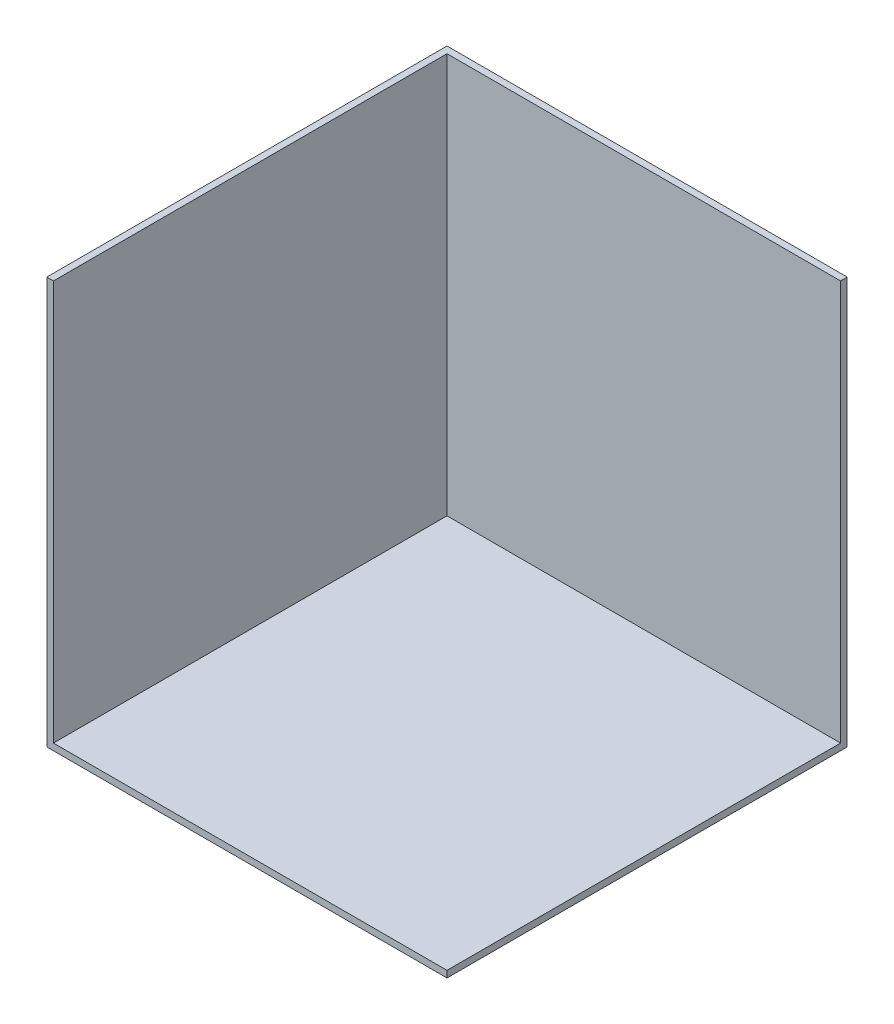
ISO-10303-21;
HEADER;
FILE_DESCRIPTION(('STEP AP214'),'2;1');
FILE_NAME('part.step','',(''),(''),'','','');
FILE_SCHEMA(('AUTOMOTIVE_DESIGN { 1 0 10303 214 1 1 1 1 }'));
ENDSEC;
DATA;
#1=APPLICATION_CONTEXT('core data for automotive mechanical design processes');
#2=APPLICATION_PROTOCOL_DEFINITION('international standard','automotive_design',2000,#1);
#3=PRODUCT_CONTEXT('',#1,'mechanical');
#4=PRODUCT('Part','Part','',(#3));
#5=PRODUCT_RELATED_PRODUCT_CATEGORY('part','',(#4));
#6=PRODUCT_DEFINITION_FORMATION('','',#4);
#7=PRODUCT_DEFINITION_CONTEXT('part definition',#1,'design');
#8=PRODUCT_DEFINITION('design','',#6,#7);
#9=PRODUCT_DEFINITION_SHAPE('','',#8);
#10=(LENGTH_UNIT() NAMED_UNIT(*) SI_UNIT(.MILLI.,.METRE.));
#11=(NAMED_UNIT(*) PLANE_ANGLE_UNIT() SI_UNIT($,.RADIAN.));
#12=(NAMED_UNIT(*) SI_UNIT($,.STERADIAN.) SOLID_ANGLE_UNIT());
#13=UNCERTAINTY_MEASURE_WITH_UNIT(LENGTH_MEASURE(1.E-05),#10,'distance_accuracy_value','');
#14=(GEOMETRIC_REPRESENTATION_CONTEXT(3) GLOBAL_UNCERTAINTY_ASSIGNED_CONTEXT((#13)) GLOBAL_UNIT_ASSIGNED_CONTEXT((#10,
#11,#12)) REPRESENTATION_CONTEXT('',''));
#15=CARTESIAN_POINT('',(0.,0.,0.));
#16=DIRECTION('',(0.,0.,1.));
#17=DIRECTION('',(1.,0.,0.));
#18=AXIS2_PLACEMENT_3D('',#15,#16,#17);
#19=CARTESIAN_POINT('',(3000.,100.,-3000.));
#20=DIRECTION('',(-1.,0.,0.));
#21=DIRECTION('',(0.,0.,1.));
#22=AXIS2_PLACEMENT_3D('',#19,#20,#21);
#23=PLANE('',#22);
#24=DIRECTION('',(0.,0.,-1.));
#25=VECTOR('',#24,1.);
#26=CARTESIAN_POINT('',(3000.,0.,-3000.));
#27=LINE('',#26,#25);
#28=CARTESIAN_POINT('',(3000.,0.,3000.));
#29=VERTEX_POINT('',#28);
#30=CARTESIAN_POINT('',(3000.,0.,-3000.));
#31=VERTEX_POINT('',#30);
#32=EDGE_CURVE('E140',#29,#31,#27,.T.);
#33=ORIENTED_EDGE('',*,*,#32,.T.);
#34=DIRECTION('',(0.,-1.,0.));
#35=VECTOR('',#34,1.);
#36=CARTESIAN_POINT('',(3000.,100.,-3000.));
#37=LINE('',#36,#35);
#38=CARTESIAN_POINT('',(3000.,6100.,-3000.));
#39=VERTEX_POINT('',#38);
#40=EDGE_CURVE('E11',#39,#31,#37,.T.);
#41=ORIENTED_EDGE('',*,*,#40,.F.);
#42=DIRECTION('',(0.,0.,-1.));
#43=VECTOR('',#42,1.);
#44=CARTESIAN_POINT('',(3000.,6100.,-2900.));
#45=LINE('',#44,#43);
#46=CARTESIAN_POINT('',(3000.,6100.,-2900.));
#47=VERTEX_POINT('',#46);
#48=EDGE_CURVE('E112',#47,#39,#45,.T.);
#49=ORIENTED_EDGE('',*,*,#48,.F.);
#50=DIRECTION('',(0.,-1.,0.));
#51=VECTOR('',#50,1.);
#52=CARTESIAN_POINT('',(3000.,6100.,-2900.));
#53=LINE('',#52,#51);
#54=CARTESIAN_POINT('',(3000.,100.,-2900.));
#55=VERTEX_POINT('',#54);
#56=EDGE_CURVE('E123',#47,#55,#53,.T.);
#57=ORIENTED_EDGE('',*,*,#56,.T.);
#58=DIRECTION('',(0.,0.,-1.));
#59=VECTOR('',#58,1.);
#60=CARTESIAN_POINT('',(3000.,100.,-3000.));
#61=LINE('',#60,#59);
#62=CARTESIAN_POINT('',(3000.,100.,3000.));
#63=VERTEX_POINT('',#62);
#64=EDGE_CURVE('E54',#63,#55,#61,.T.);
#65=ORIENTED_EDGE('',*,*,#64,.F.);
#66=DIRECTION('',(0.,-1.,0.));
#67=VECTOR('',#66,1.);
#68=CARTESIAN_POINT('',(3000.,100.,3000.));
#69=LINE('',#68,#67);
#70=EDGE_CURVE('E153',#63,#29,#69,.T.);
#71=ORIENTED_EDGE('',*,*,#70,.T.);
#72=EDGE_LOOP('',(#33,#41,#49,#57,#65,#71));
#73=FACE_BOUND('',#72,.T.);
#74=ADVANCED_FACE('F33',(#73),#23,.F.);
#75=CARTESIAN_POINT('',(-3000.,100.,-3000.));
#76=DIRECTION('',(0.,0.,1.));
#77=DIRECTION('',(1.,0.,0.));
#78=AXIS2_PLACEMENT_3D('',#75,#76,#77);
#79=PLANE('',#78);
#80=DIRECTION('',(-1.,0.,0.));
#81=VECTOR('',#80,1.);
#82=CARTESIAN_POINT('',(-3000.,0.,-3000.));
#83=LINE('',#82,#81);
#84=CARTESIAN_POINT('',(-3000.,0.,-3000.));
#85=VERTEX_POINT('',#84);
#86=EDGE_CURVE('E96',#31,#85,#83,.T.);
#87=ORIENTED_EDGE('',*,*,#86,.T.);
#88=DIRECTION('',(0.,-1.,0.));
#89=VECTOR('',#88,1.);
#90=CARTESIAN_POINT('',(-3000.,100.,-3000.));
#91=LINE('',#90,#89);
#92=CARTESIAN_POINT('',(-3000.,6100.,-3000.));
#93=VERTEX_POINT('',#92);
#94=EDGE_CURVE('E41',#93,#85,#91,.T.);
#95=ORIENTED_EDGE('',*,*,#94,.F.);
#96=DIRECTION('',(-1.,0.,0.));
#97=VECTOR('',#96,1.);
#98=CARTESIAN_POINT('',(3000.,6100.,-3000.));
#99=LINE('',#98,#97);
#100=EDGE_CURVE('E95',#39,#93,#99,.T.);
#101=ORIENTED_EDGE('',*,*,#100,.F.);
#102=ORIENTED_EDGE('',*,*,#40,.T.);
#103=EDGE_LOOP('',(#87,#95,#101,#102));
#104=FACE_BOUND('',#103,.T.);
#105=ADVANCED_FACE('F93',(#104),#79,.F.);
#106=CARTESIAN_POINT('',(-3000.,100.,-3000.));
#107=DIRECTION('',(1.,0.,0.));
#108=DIRECTION('',(0.,0.,-1.));
#109=AXIS2_PLACEMENT_3D('',#106,#107,#108);
#110=PLANE('',#109);
#111=DIRECTION('',(0.,0.,1.));
#112=VECTOR('',#111,1.);
#113=CARTESIAN_POINT('',(-3000.,0.,-3000.));
#114=LINE('',#113,#112);
#115=CARTESIAN_POINT('',(-3000.,0.,3000.));
#116=VERTEX_POINT('',#115);
#117=EDGE_CURVE('E158',#85,#116,#114,.T.);
#118=ORIENTED_EDGE('',*,*,#117,.T.);
#119=DIRECTION('',(0.,-1.,0.));
#120=VECTOR('',#119,1.);
#121=CARTESIAN_POINT('',(-3000.,100.,3000.));
#122=LINE('',#121,#120);
#123=CARTESIAN_POINT('',(-3000.,6100.,3000.));
#124=VERTEX_POINT('',#123);
#125=EDGE_CURVE('E99',#124,#116,#122,.T.);
#126=ORIENTED_EDGE('',*,*,#125,.F.);
#127=DIRECTION('',(0.,0.,1.));
#128=VECTOR('',#127,1.);
#129=CARTESIAN_POINT('',(-3000.,6100.,-3000.));
#130=LINE('',#129,#128);
#131=EDGE_CURVE('E102',#93,#124,#130,.T.);
#132=ORIENTED_EDGE('',*,*,#131,.F.);
#133=ORIENTED_EDGE('',*,*,#94,.T.);
#134=EDGE_LOOP('',(#118,#126,#132,#133));
#135=FACE_BOUND('',#134,.T.);
#136=ADVANCED_FACE('F103',(#135),#110,.F.);
#137=CARTESIAN_POINT('',(-3000.,100.,3000.));
#138=DIRECTION('',(0.,0.,-1.));
#139=DIRECTION('',(-1.,0.,0.));
#140=AXIS2_PLACEMENT_3D('',#137,#138,#139);
#141=PLANE('',#140);
#142=DIRECTION('',(1.,0.,0.));
#143=VECTOR('',#142,1.);
#144=CARTESIAN_POINT('',(-3000.,0.,3000.));
#145=LINE('',#144,#143);
#146=EDGE_CURVE('E160',#116,#29,#145,.T.);
#147=ORIENTED_EDGE('',*,*,#146,.T.);
#148=ORIENTED_EDGE('',*,*,#70,.F.);
#149=DIRECTION('',(1.,0.,0.));
#150=VECTOR('',#149,1.);
#151=CARTESIAN_POINT('',(-3000.,100.,3000.));
#152=LINE('',#151,#150);
#153=CARTESIAN_POINT('',(-2900.,100.,3000.));
#154=VERTEX_POINT('',#153);
#155=EDGE_CURVE('E150',#154,#63,#152,.T.);
#156=ORIENTED_EDGE('',*,*,#155,.F.);
#157=DIRECTION('',(0.,-1.,0.));
#158=VECTOR('',#157,1.);
#159=CARTESIAN_POINT('',(-2900.,6100.,3000.));
#160=LINE('',#159,#158);
#161=CARTESIAN_POINT('',(-2900.,6100.,3000.));
#162=VERTEX_POINT('',#161);
#163=EDGE_CURVE('E135',#162,#154,#160,.T.);
#164=ORIENTED_EDGE('',*,*,#163,.F.);
#165=DIRECTION('',(1.,0.,0.));
#166=VECTOR('',#165,1.);
#167=CARTESIAN_POINT('',(-3000.,6100.,3000.));
#168=LINE('',#167,#166);
#169=EDGE_CURVE('E107',#124,#162,#168,.T.);
#170=ORIENTED_EDGE('',*,*,#169,.F.);
#171=ORIENTED_EDGE('',*,*,#125,.T.);
#172=EDGE_LOOP('',(#147,#148,#156,#164,#170,#171));
#173=FACE_BOUND('',#172,.T.);
#174=ADVANCED_FACE('F166',(#173),#141,.F.);
#175=CARTESIAN_POINT('',(0.,100.,0.));
#176=DIRECTION('',(0.,1.,0.));
#177=DIRECTION('',(0.,0.,1.));
#178=AXIS2_PLACEMENT_3D('',#175,#176,#177);
#179=PLANE('',#178);
#180=DIRECTION('',(1.,0.,0.));
#181=VECTOR('',#180,1.);
#182=CARTESIAN_POINT('',(3000.,100.,-2900.));
#183=LINE('',#182,#181);
#184=CARTESIAN_POINT('',(-2900.,100.,-2900.));
#185=VERTEX_POINT('',#184);
#186=EDGE_CURVE('E113',#185,#55,#183,.T.);
#187=ORIENTED_EDGE('',*,*,#186,.F.);
#188=DIRECTION('',(0.,0.,-1.));
#189=VECTOR('',#188,1.);
#190=CARTESIAN_POINT('',(-2900.,100.,-2900.));
#191=LINE('',#190,#189);
#192=EDGE_CURVE('E49',#154,#185,#191,.T.);
#193=ORIENTED_EDGE('',*,*,#192,.F.);
#194=ORIENTED_EDGE('',*,*,#155,.T.);
#195=ORIENTED_EDGE('',*,*,#64,.T.);
#196=EDGE_LOOP('',(#187,#193,#194,#195));
#197=FACE_BOUND('',#196,.T.);
#198=ADVANCED_FACE('F171',(#197),#179,.T.);
#199=CARTESIAN_POINT('',(0.,0.,0.));
#200=DIRECTION('',(0.,1.,0.));
#201=DIRECTION('',(0.,0.,1.));
#202=AXIS2_PLACEMENT_3D('',#199,#200,#201);
#203=PLANE('',#202);
#204=ORIENTED_EDGE('',*,*,#32,.F.);
#205=ORIENTED_EDGE('',*,*,#146,.F.);
#206=ORIENTED_EDGE('',*,*,#117,.F.);
#207=ORIENTED_EDGE('',*,*,#86,.F.);
#208=EDGE_LOOP('',(#204,#205,#206,#207));
#209=FACE_BOUND('',#208,.T.);
#210=ADVANCED_FACE('F170',(#209),#203,.F.);
#211=CARTESIAN_POINT('',(-2900.,6100.,-2900.));
#212=DIRECTION('',(-1.,0.,0.));
#213=DIRECTION('',(0.,0.,1.));
#214=AXIS2_PLACEMENT_3D('',#211,#212,#213);
#215=PLANE('',#214);
#216=ORIENTED_EDGE('',*,*,#192,.T.);
#217=DIRECTION('',(0.,-1.,0.));
#218=VECTOR('',#217,1.);
#219=CARTESIAN_POINT('',(-2900.,6100.,-2900.));
#220=LINE('',#219,#218);
#221=CARTESIAN_POINT('',(-2900.,6100.,-2900.));
#222=VERTEX_POINT('',#221);
#223=EDGE_CURVE('E126',#222,#185,#220,.T.);
#224=ORIENTED_EDGE('',*,*,#223,.F.);
#225=DIRECTION('',(0.,0.,-1.));
#226=VECTOR('',#225,1.);
#227=CARTESIAN_POINT('',(-2900.,6100.,-2900.));
#228=LINE('',#227,#226);
#229=EDGE_CURVE('E118',#162,#222,#228,.T.);
#230=ORIENTED_EDGE('',*,*,#229,.F.);
#231=ORIENTED_EDGE('',*,*,#163,.T.);
#232=EDGE_LOOP('',(#216,#224,#230,#231));
#233=FACE_BOUND('',#232,.T.);
#234=ADVANCED_FACE('F178',(#233),#215,.F.);
#235=CARTESIAN_POINT('',(3000.,6100.,-2900.));
#236=DIRECTION('',(0.,0.,-1.));
#237=DIRECTION('',(-1.,0.,0.));
#238=AXIS2_PLACEMENT_3D('',#235,#236,#237);
#239=PLANE('',#238);
#240=ORIENTED_EDGE('',*,*,#186,.T.);
#241=ORIENTED_EDGE('',*,*,#56,.F.);
#242=DIRECTION('',(1.,0.,0.));
#243=VECTOR('',#242,1.);
#244=CARTESIAN_POINT('',(3000.,6100.,-2900.));
#245=LINE('',#244,#243);
#246=EDGE_CURVE('E120',#222,#47,#245,.T.);
#247=ORIENTED_EDGE('',*,*,#246,.F.);
#248=ORIENTED_EDGE('',*,*,#223,.T.);
#249=EDGE_LOOP('',(#240,#241,#247,#248));
#250=FACE_BOUND('',#249,.T.);
#251=ADVANCED_FACE('F211',(#250),#239,.F.);
#252=CARTESIAN_POINT('',(0.,6100.,0.));
#253=DIRECTION('',(0.,1.,0.));
#254=DIRECTION('',(0.,0.,1.));
#255=AXIS2_PLACEMENT_3D('',#252,#253,#254);
#256=PLANE('',#255);
#257=ORIENTED_EDGE('',*,*,#100,.T.);
#258=ORIENTED_EDGE('',*,*,#131,.T.);
#259=ORIENTED_EDGE('',*,*,#169,.T.);
#260=ORIENTED_EDGE('',*,*,#229,.T.);
#261=ORIENTED_EDGE('',*,*,#246,.T.);
#262=ORIENTED_EDGE('',*,*,#48,.T.);
#263=EDGE_LOOP('',(#257,#258,#259,#260,#261,#262));
#264=FACE_BOUND('',#263,.T.);
#265=ADVANCED_FACE('F110',(#264),#256,.T.);
#266=CLOSED_SHELL('',(#74,#105,#136,#174,#198,#210,#234,#251,#265));
#267=MANIFOLD_SOLID_BREP('B2',#266);
#268=ADVANCED_BREP_SHAPE_REPRESENTATION('',(#18,#267),#14);
#269=SHAPE_DEFINITION_REPRESENTATION(#9,#268);
ENDSEC;
END-ISO-10303-21;
